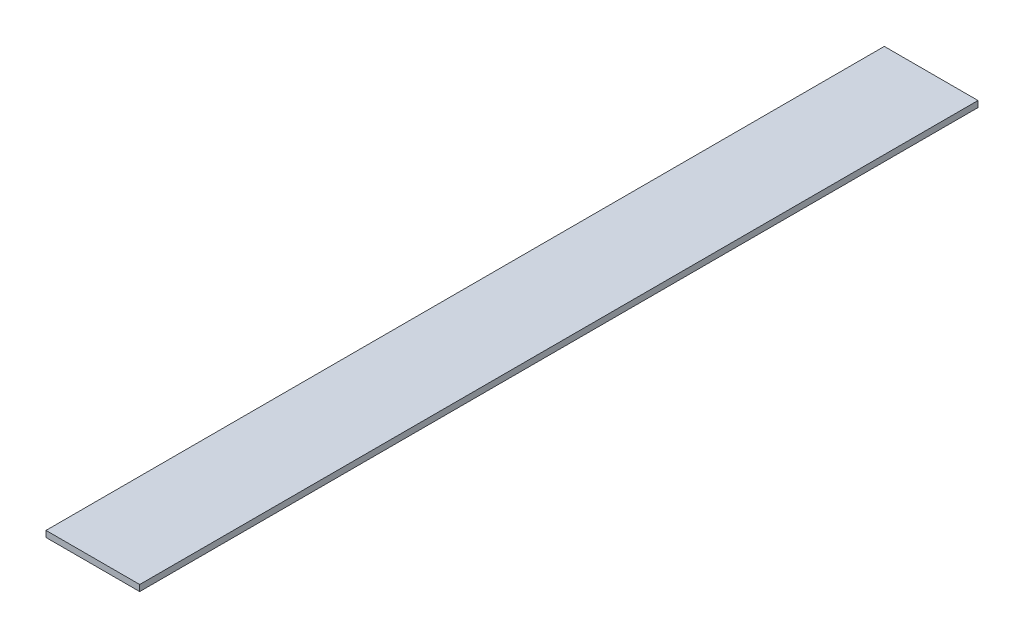
ISO-10303-21;
HEADER;
FILE_DESCRIPTION(('STEP AP214'),'2;1');
FILE_NAME('part.step','',(''),(''),'','','');
FILE_SCHEMA(('AUTOMOTIVE_DESIGN { 1 0 10303 214 1 1 1 1 }'));
ENDSEC;
DATA;
#1=APPLICATION_CONTEXT('core data for automotive mechanical design processes');
#2=APPLICATION_PROTOCOL_DEFINITION('international standard','automotive_design',2000,#1);
#3=PRODUCT_CONTEXT('',#1,'mechanical');
#4=PRODUCT('Part','Part','',(#3));
#5=PRODUCT_RELATED_PRODUCT_CATEGORY('part','',(#4));
#6=PRODUCT_DEFINITION_FORMATION('','',#4);
#7=PRODUCT_DEFINITION_CONTEXT('part definition',#1,'design');
#8=PRODUCT_DEFINITION('design','',#6,#7);
#9=PRODUCT_DEFINITION_SHAPE('','',#8);
#10=(LENGTH_UNIT() NAMED_UNIT(*) SI_UNIT(.MILLI.,.METRE.));
#11=(NAMED_UNIT(*) PLANE_ANGLE_UNIT() SI_UNIT($,.RADIAN.));
#12=(NAMED_UNIT(*) SI_UNIT($,.STERADIAN.) SOLID_ANGLE_UNIT());
#13=UNCERTAINTY_MEASURE_WITH_UNIT(LENGTH_MEASURE(1.E-05),#10,'distance_accuracy_value','');
#14=(GEOMETRIC_REPRESENTATION_CONTEXT(3) GLOBAL_UNCERTAINTY_ASSIGNED_CONTEXT((#13)) GLOBAL_UNIT_ASSIGNED_CONTEXT((#10,
#11,#12)) REPRESENTATION_CONTEXT('',''));
#15=CARTESIAN_POINT('',(0.,0.,0.));
#16=DIRECTION('',(0.,0.,1.));
#17=DIRECTION('',(1.,0.,0.));
#18=AXIS2_PLACEMENT_3D('',#15,#16,#17);
#19=CARTESIAN_POINT('',(-38.,25.,-700.));
#20=DIRECTION('',(-1.,0.,0.));
#21=DIRECTION('',(0.,0.,1.));
#22=AXIS2_PLACEMENT_3D('',#19,#20,#21);
#23=PLANE('',#22);
#24=DIRECTION('',(0.,-1.,0.));
#25=VECTOR('',#24,1.);
#26=CARTESIAN_POINT('',(-38.,25.,-20.));
#27=LINE('',#26,#25);
#28=CARTESIAN_POINT('',(-38.,30.,-20.));
#29=VERTEX_POINT('',#28);
#30=CARTESIAN_POINT('',(-38.,25.,-20.));
#31=VERTEX_POINT('',#30);
#32=EDGE_CURVE('E103',#29,#31,#27,.T.);
#33=ORIENTED_EDGE('',*,*,#32,.F.);
#34=DIRECTION('',(0.,0.,1.));
#35=VECTOR('',#34,1.);
#36=CARTESIAN_POINT('',(-38.,30.,-700.));
#37=LINE('',#36,#35);
#38=CARTESIAN_POINT('',(-38.,30.,-700.));
#39=VERTEX_POINT('',#38);
#40=EDGE_CURVE('E11',#39,#29,#37,.T.);
#41=ORIENTED_EDGE('',*,*,#40,.F.);
#42=DIRECTION('',(0.,-1.,0.));
#43=VECTOR('',#42,1.);
#44=CARTESIAN_POINT('',(-38.,25.,-700.));
#45=LINE('',#44,#43);
#46=CARTESIAN_POINT('',(-38.,25.,-700.));
#47=VERTEX_POINT('',#46);
#48=EDGE_CURVE('E97',#39,#47,#45,.T.);
#49=ORIENTED_EDGE('',*,*,#48,.T.);
#50=DIRECTION('',(0.,0.,1.));
#51=VECTOR('',#50,1.);
#52=CARTESIAN_POINT('',(-38.,25.,-700.));
#53=LINE('',#52,#51);
#54=EDGE_CURVE('E42',#47,#31,#53,.T.);
#55=ORIENTED_EDGE('',*,*,#54,.T.);
#56=EDGE_LOOP('',(#33,#41,#49,#55));
#57=FACE_BOUND('',#56,.T.);
#58=ADVANCED_FACE('F39',(#57),#23,.T.);
#59=CARTESIAN_POINT('',(-38.,30.,-700.));
#60=DIRECTION('',(0.,1.,0.));
#61=DIRECTION('',(0.,0.,1.));
#62=AXIS2_PLACEMENT_3D('',#59,#60,#61);
#63=PLANE('',#62);
#64=DIRECTION('',(-1.,0.,0.));
#65=VECTOR('',#64,1.);
#66=CARTESIAN_POINT('',(-38.,30.,-20.));
#67=LINE('',#66,#65);
#68=CARTESIAN_POINT('',(38.,30.,-20.));
#69=VERTEX_POINT('',#68);
#70=EDGE_CURVE('E99',#69,#29,#67,.T.);
#71=ORIENTED_EDGE('',*,*,#70,.F.);
#72=DIRECTION('',(0.,0.,1.));
#73=VECTOR('',#72,1.);
#74=CARTESIAN_POINT('',(38.,30.,-700.));
#75=LINE('',#74,#73);
#76=CARTESIAN_POINT('',(38.,30.,-700.));
#77=VERTEX_POINT('',#76);
#78=EDGE_CURVE('E48',#77,#69,#75,.T.);
#79=ORIENTED_EDGE('',*,*,#78,.F.);
#80=DIRECTION('',(-1.,0.,0.));
#81=VECTOR('',#80,1.);
#82=CARTESIAN_POINT('',(-38.,30.,-700.));
#83=LINE('',#82,#81);
#84=EDGE_CURVE('E94',#77,#39,#83,.T.);
#85=ORIENTED_EDGE('',*,*,#84,.T.);
#86=ORIENTED_EDGE('',*,*,#40,.T.);
#87=EDGE_LOOP('',(#71,#79,#85,#86));
#88=FACE_BOUND('',#87,.T.);
#89=ADVANCED_FACE('F113',(#88),#63,.T.);
#90=CARTESIAN_POINT('',(38.,25.,-700.));
#91=DIRECTION('',(1.,0.,0.));
#92=DIRECTION('',(0.,0.,-1.));
#93=AXIS2_PLACEMENT_3D('',#90,#91,#92);
#94=PLANE('',#93);
#95=DIRECTION('',(0.,1.,0.));
#96=VECTOR('',#95,1.);
#97=CARTESIAN_POINT('',(38.,25.,-20.));
#98=LINE('',#97,#96);
#99=CARTESIAN_POINT('',(38.,25.,-20.));
#100=VERTEX_POINT('',#99);
#101=EDGE_CURVE('E89',#100,#69,#98,.T.);
#102=ORIENTED_EDGE('',*,*,#101,.F.);
#103=DIRECTION('',(0.,0.,1.));
#104=VECTOR('',#103,1.);
#105=CARTESIAN_POINT('',(38.,25.,-700.));
#106=LINE('',#105,#104);
#107=CARTESIAN_POINT('',(38.,25.,-700.));
#108=VERTEX_POINT('',#107);
#109=EDGE_CURVE('E84',#108,#100,#106,.T.);
#110=ORIENTED_EDGE('',*,*,#109,.F.);
#111=DIRECTION('',(0.,1.,0.));
#112=VECTOR('',#111,1.);
#113=CARTESIAN_POINT('',(38.,25.,-700.));
#114=LINE('',#113,#112);
#115=EDGE_CURVE('E87',#108,#77,#114,.T.);
#116=ORIENTED_EDGE('',*,*,#115,.T.);
#117=ORIENTED_EDGE('',*,*,#78,.T.);
#118=EDGE_LOOP('',(#102,#110,#116,#117));
#119=FACE_BOUND('',#118,.T.);
#120=ADVANCED_FACE('F86',(#119),#94,.T.);
#121=CARTESIAN_POINT('',(-38.,25.,-700.));
#122=DIRECTION('',(0.,-1.,0.));
#123=DIRECTION('',(0.,0.,-1.));
#124=AXIS2_PLACEMENT_3D('',#121,#122,#123);
#125=PLANE('',#124);
#126=DIRECTION('',(1.,0.,0.));
#127=VECTOR('',#126,1.);
#128=CARTESIAN_POINT('',(-38.,25.,-20.));
#129=LINE('',#128,#127);
#130=EDGE_CURVE('E106',#31,#100,#129,.T.);
#131=ORIENTED_EDGE('',*,*,#130,.F.);
#132=ORIENTED_EDGE('',*,*,#54,.F.);
#133=DIRECTION('',(1.,0.,0.));
#134=VECTOR('',#133,1.);
#135=CARTESIAN_POINT('',(-38.,25.,-700.));
#136=LINE('',#135,#134);
#137=EDGE_CURVE('E93',#47,#108,#136,.T.);
#138=ORIENTED_EDGE('',*,*,#137,.T.);
#139=ORIENTED_EDGE('',*,*,#109,.T.);
#140=EDGE_LOOP('',(#131,#132,#138,#139));
#141=FACE_BOUND('',#140,.T.);
#142=ADVANCED_FACE('F96',(#141),#125,.T.);
#143=CARTESIAN_POINT('',(0.,0.,-700.));
#144=DIRECTION('',(0.,0.,-1.));
#145=DIRECTION('',(-1.,0.,0.));
#146=AXIS2_PLACEMENT_3D('',#143,#144,#145);
#147=PLANE('',#146);
#148=ORIENTED_EDGE('',*,*,#48,.F.);
#149=ORIENTED_EDGE('',*,*,#84,.F.);
#150=ORIENTED_EDGE('',*,*,#115,.F.);
#151=ORIENTED_EDGE('',*,*,#137,.F.);
#152=EDGE_LOOP('',(#148,#149,#150,#151));
#153=FACE_BOUND('',#152,.T.);
#154=ADVANCED_FACE('F92',(#153),#147,.T.);
#155=CARTESIAN_POINT('',(0.,0.,-20.));
#156=DIRECTION('',(0.,0.,-1.));
#157=DIRECTION('',(-1.,0.,0.));
#158=AXIS2_PLACEMENT_3D('',#155,#156,#157);
#159=PLANE('',#158);
#160=ORIENTED_EDGE('',*,*,#32,.T.);
#161=ORIENTED_EDGE('',*,*,#130,.T.);
#162=ORIENTED_EDGE('',*,*,#101,.T.);
#163=ORIENTED_EDGE('',*,*,#70,.T.);
#164=EDGE_LOOP('',(#160,#161,#162,#163));
#165=FACE_BOUND('',#164,.T.);
#166=ADVANCED_FACE('F112',(#165),#159,.F.);
#167=CLOSED_SHELL('',(#58,#89,#120,#142,#154,#166));
#168=MANIFOLD_SOLID_BREP('B2',#167);
#169=ADVANCED_BREP_SHAPE_REPRESENTATION('',(#18,#168),#14);
#170=SHAPE_DEFINITION_REPRESENTATION(#9,#169);
ENDSEC;
END-ISO-10303-21;
